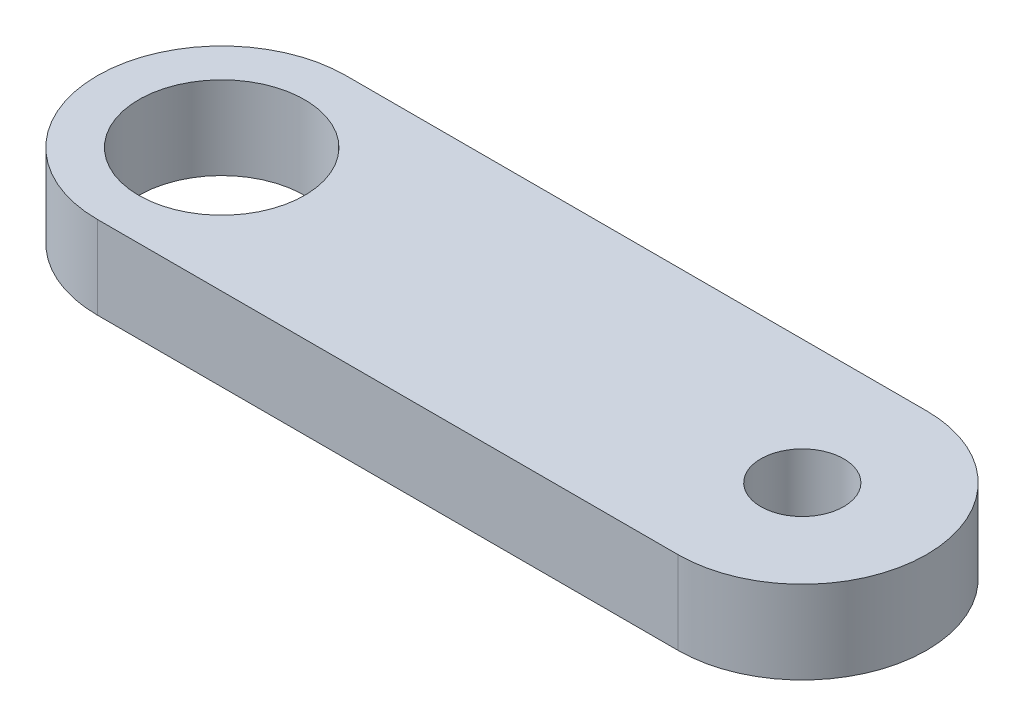
ISO-10303-21;
HEADER;
FILE_DESCRIPTION(('STEP AP214'),'2;1');
FILE_NAME('part.step','',(''),(''),'','','');
FILE_SCHEMA(('AUTOMOTIVE_DESIGN { 1 0 10303 214 1 1 1 1 }'));
ENDSEC;
DATA;
#1=APPLICATION_CONTEXT('core data for automotive mechanical design processes');
#2=APPLICATION_PROTOCOL_DEFINITION('international standard','automotive_design',2000,#1);
#3=PRODUCT_CONTEXT('',#1,'mechanical');
#4=PRODUCT('Part','Part','',(#3));
#5=PRODUCT_RELATED_PRODUCT_CATEGORY('part','',(#4));
#6=PRODUCT_DEFINITION_FORMATION('','',#4);
#7=PRODUCT_DEFINITION_CONTEXT('part definition',#1,'design');
#8=PRODUCT_DEFINITION('design','',#6,#7);
#9=PRODUCT_DEFINITION_SHAPE('','',#8);
#10=(LENGTH_UNIT() NAMED_UNIT(*) SI_UNIT(.MILLI.,.METRE.));
#11=(NAMED_UNIT(*) PLANE_ANGLE_UNIT() SI_UNIT($,.RADIAN.));
#12=(NAMED_UNIT(*) SI_UNIT($,.STERADIAN.) SOLID_ANGLE_UNIT());
#13=UNCERTAINTY_MEASURE_WITH_UNIT(LENGTH_MEASURE(1.E-05),#10,'distance_accuracy_value','');
#14=(GEOMETRIC_REPRESENTATION_CONTEXT(3) GLOBAL_UNCERTAINTY_ASSIGNED_CONTEXT((#13)) GLOBAL_UNIT_ASSIGNED_CONTEXT((#10,
#11,#12)) REPRESENTATION_CONTEXT('',''));
#15=CARTESIAN_POINT('',(0.,0.,0.));
#16=DIRECTION('',(0.,0.,1.));
#17=DIRECTION('',(1.,0.,0.));
#18=AXIS2_PLACEMENT_3D('',#15,#16,#17);
#19=CARTESIAN_POINT('',(0.,5.,-7.5));
#20=DIRECTION('',(0.,1.,0.));
#21=DIRECTION('',(0.,0.,1.));
#22=AXIS2_PLACEMENT_3D('',#19,#20,#21);
#23=PLANE('',#22);
#24=CARTESIAN_POINT('',(35.,5.,-7.50000000000001));
#25=DIRECTION('',(0.,1.,0.));
#26=DIRECTION('',(0.,0.,1.));
#27=AXIS2_PLACEMENT_3D('',#24,#25,#26);
#28=CIRCLE('',#27,2.5);
#29=CARTESIAN_POINT('',(35.,5.,-5.));
#30=VERTEX_POINT('',#29);
#31=EDGE_CURVE('E99',#30,#30,#28,.T.);
#32=ORIENTED_EDGE('',*,*,#31,.F.);
#33=EDGE_LOOP('',(#32));
#34=FACE_BOUND('',#33,.T.);
#35=CARTESIAN_POINT('',(0.,5.,-7.5));
#36=DIRECTION('',(0.,1.,0.));
#37=DIRECTION('',(0.,0.,1.));
#38=AXIS2_PLACEMENT_3D('',#35,#36,#37);
#39=CIRCLE('',#38,7.5);
#40=CARTESIAN_POINT('',(0.,5.,-15.));
#41=VERTEX_POINT('',#40);
#42=CARTESIAN_POINT('',(0.,5.,0.));
#43=VERTEX_POINT('',#42);
#44=EDGE_CURVE('E84',#41,#43,#39,.T.);
#45=ORIENTED_EDGE('',*,*,#44,.T.);
#46=DIRECTION('',(1.,0.,0.));
#47=VECTOR('',#46,1.);
#48=CARTESIAN_POINT('',(0.,5.,0.));
#49=LINE('',#48,#47);
#50=CARTESIAN_POINT('',(35.,5.,0.));
#51=VERTEX_POINT('',#50);
#52=EDGE_CURVE('E79',#43,#51,#49,.T.);
#53=ORIENTED_EDGE('',*,*,#52,.T.);
#54=CARTESIAN_POINT('',(35.,5.,-7.50000000000001));
#55=DIRECTION('',(0.,1.,0.));
#56=DIRECTION('',(0.,0.,1.));
#57=AXIS2_PLACEMENT_3D('',#54,#55,#56);
#58=CIRCLE('',#57,7.49999999999999);
#59=CARTESIAN_POINT('',(35.,5.,-15.));
#60=VERTEX_POINT('',#59);
#61=EDGE_CURVE('E82',#51,#60,#58,.T.);
#62=ORIENTED_EDGE('',*,*,#61,.T.);
#63=DIRECTION('',(-1.,0.,0.));
#64=VECTOR('',#63,1.);
#65=CARTESIAN_POINT('',(0.,5.,-15.));
#66=LINE('',#65,#64);
#67=EDGE_CURVE('E49',#60,#41,#66,.T.);
#68=ORIENTED_EDGE('',*,*,#67,.T.);
#69=EDGE_LOOP('',(#45,#53,#62,#68));
#70=FACE_BOUND('',#69,.T.);
#71=CARTESIAN_POINT('',(0.,5.,-7.5));
#72=DIRECTION('',(0.,1.,0.));
#73=DIRECTION('',(0.,0.,1.));
#74=AXIS2_PLACEMENT_3D('',#71,#72,#73);
#75=CIRCLE('',#74,5.);
#76=CARTESIAN_POINT('',(0.,5.,-2.5));
#77=VERTEX_POINT('',#76);
#78=EDGE_CURVE('E114',#77,#77,#75,.T.);
#79=ORIENTED_EDGE('',*,*,#78,.F.);
#80=EDGE_LOOP('',(#79));
#81=FACE_BOUND('',#80,.T.);
#82=ADVANCED_FACE('F32',(#34,#70,#81),#23,.T.);
#83=CARTESIAN_POINT('',(0.,0.,-7.5));
#84=DIRECTION('',(0.,1.,0.));
#85=DIRECTION('',(0.,0.,1.));
#86=AXIS2_PLACEMENT_3D('',#83,#84,#85);
#87=PLANE('',#86);
#88=CARTESIAN_POINT('',(0.,0.,-7.5));
#89=DIRECTION('',(0.,1.,0.));
#90=DIRECTION('',(0.,0.,1.));
#91=AXIS2_PLACEMENT_3D('',#88,#89,#90);
#92=CIRCLE('',#91,7.5);
#93=CARTESIAN_POINT('',(0.,0.,-15.));
#94=VERTEX_POINT('',#93);
#95=CARTESIAN_POINT('',(0.,0.,0.));
#96=VERTEX_POINT('',#95);
#97=EDGE_CURVE('E96',#94,#96,#92,.T.);
#98=ORIENTED_EDGE('',*,*,#97,.F.);
#99=DIRECTION('',(-1.,0.,0.));
#100=VECTOR('',#99,1.);
#101=CARTESIAN_POINT('',(0.,0.,-15.));
#102=LINE('',#101,#100);
#103=CARTESIAN_POINT('',(35.,0.,-15.));
#104=VERTEX_POINT('',#103);
#105=EDGE_CURVE('E72',#104,#94,#102,.T.);
#106=ORIENTED_EDGE('',*,*,#105,.F.);
#107=CARTESIAN_POINT('',(35.,0.,-7.50000000000001));
#108=DIRECTION('',(0.,1.,0.));
#109=DIRECTION('',(0.,0.,1.));
#110=AXIS2_PLACEMENT_3D('',#107,#108,#109);
#111=CIRCLE('',#110,7.49999999999999);
#112=CARTESIAN_POINT('',(35.,0.,0.));
#113=VERTEX_POINT('',#112);
#114=EDGE_CURVE('E66',#113,#104,#111,.T.);
#115=ORIENTED_EDGE('',*,*,#114,.F.);
#116=DIRECTION('',(1.,0.,0.));
#117=VECTOR('',#116,1.);
#118=CARTESIAN_POINT('',(0.,0.,0.));
#119=LINE('',#118,#117);
#120=EDGE_CURVE('E88',#96,#113,#119,.T.);
#121=ORIENTED_EDGE('',*,*,#120,.F.);
#122=EDGE_LOOP('',(#98,#106,#115,#121));
#123=FACE_BOUND('',#122,.T.);
#124=CARTESIAN_POINT('',(35.,0.,-7.50000000000001));
#125=DIRECTION('',(0.,1.,0.));
#126=DIRECTION('',(0.,0.,1.));
#127=AXIS2_PLACEMENT_3D('',#124,#125,#126);
#128=CIRCLE('',#127,2.5);
#129=CARTESIAN_POINT('',(35.,0.,-5.));
#130=VERTEX_POINT('',#129);
#131=EDGE_CURVE('E111',#130,#130,#128,.T.);
#132=ORIENTED_EDGE('',*,*,#131,.T.);
#133=EDGE_LOOP('',(#132));
#134=FACE_BOUND('',#133,.T.);
#135=CARTESIAN_POINT('',(0.,0.,-7.5));
#136=DIRECTION('',(0.,1.,0.));
#137=DIRECTION('',(0.,0.,1.));
#138=AXIS2_PLACEMENT_3D('',#135,#136,#137);
#139=CIRCLE('',#138,5.);
#140=CARTESIAN_POINT('',(0.,0.,-2.5));
#141=VERTEX_POINT('',#140);
#142=EDGE_CURVE('E117',#141,#141,#139,.T.);
#143=ORIENTED_EDGE('',*,*,#142,.T.);
#144=EDGE_LOOP('',(#143));
#145=FACE_BOUND('',#144,.T.);
#146=ADVANCED_FACE('F107',(#123,#134,#145),#87,.F.);
#147=CARTESIAN_POINT('',(0.,5.,-7.5));
#148=DIRECTION('',(0.,-1.,0.));
#149=DIRECTION('',(0.,0.,-1.));
#150=AXIS2_PLACEMENT_3D('',#147,#148,#149);
#151=CYLINDRICAL_SURFACE('',#150,7.5);
#152=ORIENTED_EDGE('',*,*,#97,.T.);
#153=DIRECTION('',(0.,-1.,0.));
#154=VECTOR('',#153,1.);
#155=CARTESIAN_POINT('',(0.,5.,0.));
#156=LINE('',#155,#154);
#157=EDGE_CURVE('E11',#43,#96,#156,.T.);
#158=ORIENTED_EDGE('',*,*,#157,.F.);
#159=ORIENTED_EDGE('',*,*,#44,.F.);
#160=DIRECTION('',(0.,-1.,0.));
#161=VECTOR('',#160,1.);
#162=CARTESIAN_POINT('',(0.,5.,-15.));
#163=LINE('',#162,#161);
#164=EDGE_CURVE('E92',#41,#94,#163,.T.);
#165=ORIENTED_EDGE('',*,*,#164,.T.);
#166=EDGE_LOOP('',(#152,#158,#159,#165));
#167=FACE_BOUND('',#166,.T.);
#168=ADVANCED_FACE('F34',(#167),#151,.T.);
#169=CARTESIAN_POINT('',(0.,5.,0.));
#170=DIRECTION('',(0.,0.,-1.));
#171=DIRECTION('',(-1.,0.,0.));
#172=AXIS2_PLACEMENT_3D('',#169,#170,#171);
#173=PLANE('',#172);
#174=ORIENTED_EDGE('',*,*,#120,.T.);
#175=DIRECTION('',(0.,-1.,0.));
#176=VECTOR('',#175,1.);
#177=CARTESIAN_POINT('',(35.,5.,0.));
#178=LINE('',#177,#176);
#179=EDGE_CURVE('E41',#51,#113,#178,.T.);
#180=ORIENTED_EDGE('',*,*,#179,.F.);
#181=ORIENTED_EDGE('',*,*,#52,.F.);
#182=ORIENTED_EDGE('',*,*,#157,.T.);
#183=EDGE_LOOP('',(#174,#180,#181,#182));
#184=FACE_BOUND('',#183,.T.);
#185=ADVANCED_FACE('F87',(#184),#173,.F.);
#186=CARTESIAN_POINT('',(35.,5.,-7.50000000000001));
#187=DIRECTION('',(0.,-1.,0.));
#188=DIRECTION('',(0.,0.,-1.));
#189=AXIS2_PLACEMENT_3D('',#186,#187,#188);
#190=CYLINDRICAL_SURFACE('',#189,7.49999999999999);
#191=ORIENTED_EDGE('',*,*,#114,.T.);
#192=DIRECTION('',(0.,-1.,0.));
#193=VECTOR('',#192,1.);
#194=CARTESIAN_POINT('',(35.,5.,-15.));
#195=LINE('',#194,#193);
#196=EDGE_CURVE('E89',#60,#104,#195,.T.);
#197=ORIENTED_EDGE('',*,*,#196,.F.);
#198=ORIENTED_EDGE('',*,*,#61,.F.);
#199=ORIENTED_EDGE('',*,*,#179,.T.);
#200=EDGE_LOOP('',(#191,#197,#198,#199));
#201=FACE_BOUND('',#200,.T.);
#202=ADVANCED_FACE('F90',(#201),#190,.T.);
#203=CARTESIAN_POINT('',(0.,5.,-15.));
#204=DIRECTION('',(0.,0.,1.));
#205=DIRECTION('',(1.,0.,0.));
#206=AXIS2_PLACEMENT_3D('',#203,#204,#205);
#207=PLANE('',#206);
#208=ORIENTED_EDGE('',*,*,#105,.T.);
#209=ORIENTED_EDGE('',*,*,#164,.F.);
#210=ORIENTED_EDGE('',*,*,#67,.F.);
#211=ORIENTED_EDGE('',*,*,#196,.T.);
#212=EDGE_LOOP('',(#208,#209,#210,#211));
#213=FACE_BOUND('',#212,.T.);
#214=ADVANCED_FACE('F104',(#213),#207,.F.);
#215=CARTESIAN_POINT('',(35.,5.,-7.50000000000001));
#216=DIRECTION('',(0.,-1.,0.));
#217=DIRECTION('',(0.,0.,-1.));
#218=AXIS2_PLACEMENT_3D('',#215,#216,#217);
#219=CYLINDRICAL_SURFACE('',#218,2.5);
#220=ORIENTED_EDGE('',*,*,#31,.T.);
#221=EDGE_LOOP('',(#220));
#222=FACE_BOUND('',#221,.T.);
#223=ORIENTED_EDGE('',*,*,#131,.F.);
#224=EDGE_LOOP('',(#223));
#225=FACE_BOUND('',#224,.T.);
#226=ADVANCED_FACE('F134',(#222,#225),#219,.F.);
#227=CARTESIAN_POINT('',(0.,5.,-7.5));
#228=DIRECTION('',(0.,-1.,0.));
#229=DIRECTION('',(0.,0.,-1.));
#230=AXIS2_PLACEMENT_3D('',#227,#228,#229);
#231=CYLINDRICAL_SURFACE('',#230,5.);
#232=ORIENTED_EDGE('',*,*,#78,.T.);
#233=EDGE_LOOP('',(#232));
#234=FACE_BOUND('',#233,.T.);
#235=ORIENTED_EDGE('',*,*,#142,.F.);
#236=EDGE_LOOP('',(#235));
#237=FACE_BOUND('',#236,.T.);
#238=ADVANCED_FACE('F123',(#234,#237),#231,.F.);
#239=CLOSED_SHELL('',(#82,#146,#168,#185,#202,#214,#226,#238));
#240=MANIFOLD_SOLID_BREP('B2',#239);
#241=ADVANCED_BREP_SHAPE_REPRESENTATION('',(#18,#240),#14);
#242=SHAPE_DEFINITION_REPRESENTATION(#9,#241);
ENDSEC;
END-ISO-10303-21;
